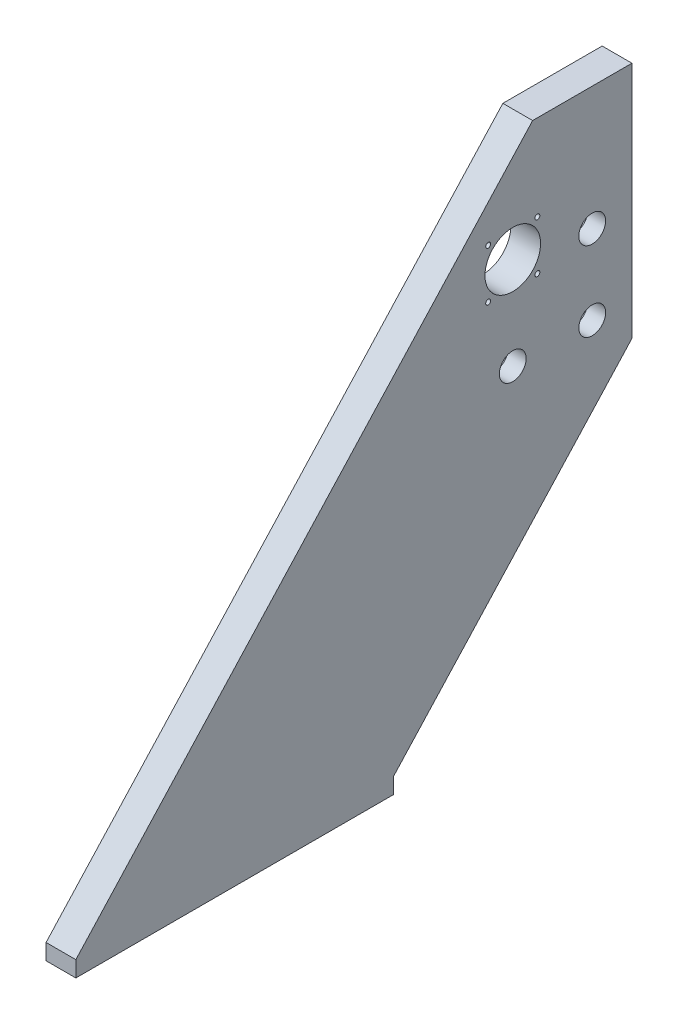
ISO-10303-21;
HEADER;
FILE_DESCRIPTION(('STEP AP214'),'2;1');
FILE_NAME('part.step','',(''),(''),'','','');
FILE_SCHEMA(('AUTOMOTIVE_DESIGN { 1 0 10303 214 1 1 1 1 }'));
ENDSEC;
DATA;
#1=APPLICATION_CONTEXT('core data for automotive mechanical design processes');
#2=APPLICATION_PROTOCOL_DEFINITION('international standard','automotive_design',2000,#1);
#3=PRODUCT_CONTEXT('',#1,'mechanical');
#4=PRODUCT('Part','Part','',(#3));
#5=PRODUCT_RELATED_PRODUCT_CATEGORY('part','',(#4));
#6=PRODUCT_DEFINITION_FORMATION('','',#4);
#7=PRODUCT_DEFINITION_CONTEXT('part definition',#1,'design');
#8=PRODUCT_DEFINITION('design','',#6,#7);
#9=PRODUCT_DEFINITION_SHAPE('','',#8);
#10=(LENGTH_UNIT() NAMED_UNIT(*) SI_UNIT(.MILLI.,.METRE.));
#11=(NAMED_UNIT(*) PLANE_ANGLE_UNIT() SI_UNIT($,.RADIAN.));
#12=(NAMED_UNIT(*) SI_UNIT($,.STERADIAN.) SOLID_ANGLE_UNIT());
#13=UNCERTAINTY_MEASURE_WITH_UNIT(LENGTH_MEASURE(1.E-05),#10,'distance_accuracy_value','');
#14=(GEOMETRIC_REPRESENTATION_CONTEXT(3) GLOBAL_UNCERTAINTY_ASSIGNED_CONTEXT((#13)) GLOBAL_UNIT_ASSIGNED_CONTEXT((#10,
#11,#12)) REPRESENTATION_CONTEXT('',''));
#15=CARTESIAN_POINT('',(0.,0.,0.));
#16=DIRECTION('',(0.,0.,1.));
#17=DIRECTION('',(1.,0.,0.));
#18=AXIS2_PLACEMENT_3D('',#15,#16,#17);
#19=CARTESIAN_POINT('',(7.5,8.,80.));
#20=DIRECTION('',(0.,0.,-1.));
#21=DIRECTION('',(0.,1.,0.));
#22=AXIS2_PLACEMENT_3D('',#19,#20,#21);
#23=PLANE('',#22);
#24=DIRECTION('',(0.,-1.,0.));
#25=VECTOR('',#24,1.);
#26=CARTESIAN_POINT('',(-7.5,8.,80.));
#27=LINE('',#26,#25);
#28=CARTESIAN_POINT('',(-7.5,8.,80.));
#29=VERTEX_POINT('',#28);
#30=CARTESIAN_POINT('',(-7.5,0.,80.));
#31=VERTEX_POINT('',#30);
#32=EDGE_CURVE('E145',#29,#31,#27,.T.);
#33=ORIENTED_EDGE('',*,*,#32,.T.);
#34=DIRECTION('',(-1.,0.,0.));
#35=VECTOR('',#34,1.);
#36=CARTESIAN_POINT('',(7.5,0.,80.));
#37=LINE('',#36,#35);
#38=CARTESIAN_POINT('',(7.5,0.,80.));
#39=VERTEX_POINT('',#38);
#40=EDGE_CURVE('E11',#39,#31,#37,.T.);
#41=ORIENTED_EDGE('',*,*,#40,.F.);
#42=DIRECTION('',(0.,-1.,0.));
#43=VECTOR('',#42,1.);
#44=CARTESIAN_POINT('',(7.5,8.,80.));
#45=LINE('',#44,#43);
#46=CARTESIAN_POINT('',(7.5,8.,80.));
#47=VERTEX_POINT('',#46);
#48=EDGE_CURVE('E165',#47,#39,#45,.T.);
#49=ORIENTED_EDGE('',*,*,#48,.F.);
#50=DIRECTION('',(-1.,0.,0.));
#51=VECTOR('',#50,1.);
#52=CARTESIAN_POINT('',(7.5,8.,80.));
#53=LINE('',#52,#51);
#54=EDGE_CURVE('E141',#47,#29,#53,.T.);
#55=ORIENTED_EDGE('',*,*,#54,.T.);
#56=EDGE_LOOP('',(#33,#41,#49,#55));
#57=FACE_BOUND('',#56,.T.);
#58=ADVANCED_FACE('F45',(#57),#23,.F.);
#59=CARTESIAN_POINT('',(7.5,0.,0.));
#60=DIRECTION('',(0.,1.,0.));
#61=DIRECTION('',(0.,0.,1.));
#62=AXIS2_PLACEMENT_3D('',#59,#60,#61);
#63=PLANE('',#62);
#64=CARTESIAN_POINT('',(0.,0.,50.));
#65=DIRECTION('',(0.,-1.,0.));
#66=DIRECTION('',(0.,0.,-1.));
#67=AXIS2_PLACEMENT_3D('',#64,#65,#66);
#68=CIRCLE('',#67,3.4);
#69=CARTESIAN_POINT('',(0.,0.,46.6));
#70=VERTEX_POINT('',#69);
#71=EDGE_CURVE('E210',#70,#70,#68,.T.);
#72=ORIENTED_EDGE('',*,*,#71,.F.);
#73=EDGE_LOOP('',(#72));
#74=FACE_BOUND('',#73,.T.);
#75=CARTESIAN_POINT('',(0.,0.,-50.));
#76=DIRECTION('',(0.,-1.,0.));
#77=DIRECTION('',(0.,0.,-1.));
#78=AXIS2_PLACEMENT_3D('',#75,#76,#77);
#79=CIRCLE('',#78,3.4);
#80=CARTESIAN_POINT('',(0.,0.,-53.4));
#81=VERTEX_POINT('',#80);
#82=EDGE_CURVE('E202',#81,#81,#79,.T.);
#83=ORIENTED_EDGE('',*,*,#82,.F.);
#84=EDGE_LOOP('',(#83));
#85=FACE_BOUND('',#84,.T.);
#86=DIRECTION('',(0.,0.,-1.));
#87=VECTOR('',#86,1.);
#88=CARTESIAN_POINT('',(-7.5,0.,0.));
#89=LINE('',#88,#87);
#90=CARTESIAN_POINT('',(-7.5,0.,-80.));
#91=VERTEX_POINT('',#90);
#92=EDGE_CURVE('E149',#31,#91,#89,.T.);
#93=ORIENTED_EDGE('',*,*,#92,.T.);
#94=DIRECTION('',(-1.,0.,0.));
#95=VECTOR('',#94,1.);
#96=CARTESIAN_POINT('',(7.5,0.,-80.));
#97=LINE('',#96,#95);
#98=CARTESIAN_POINT('',(7.5,0.,-80.));
#99=VERTEX_POINT('',#98);
#100=EDGE_CURVE('E54',#99,#91,#97,.T.);
#101=ORIENTED_EDGE('',*,*,#100,.F.);
#102=DIRECTION('',(0.,0.,-1.));
#103=VECTOR('',#102,1.);
#104=CARTESIAN_POINT('',(7.5,0.,80.));
#105=LINE('',#104,#103);
#106=EDGE_CURVE('E103',#39,#99,#105,.T.);
#107=ORIENTED_EDGE('',*,*,#106,.F.);
#108=ORIENTED_EDGE('',*,*,#40,.T.);
#109=EDGE_LOOP('',(#93,#101,#107,#108));
#110=FACE_BOUND('',#109,.T.);
#111=ADVANCED_FACE('F365',(#74,#85,#110),#63,.F.);
#112=CARTESIAN_POINT('',(7.5,0.,-80.));
#113=DIRECTION('',(0.,0.,1.));
#114=DIRECTION('',(1.,0.,0.));
#115=AXIS2_PLACEMENT_3D('',#112,#113,#114);
#116=PLANE('',#115);
#117=DIRECTION('',(0.,1.,0.));
#118=VECTOR('',#117,1.);
#119=CARTESIAN_POINT('',(-7.5,0.,-80.));
#120=LINE('',#119,#118);
#121=CARTESIAN_POINT('',(-7.5,8.,-80.));
#122=VERTEX_POINT('',#121);
#123=EDGE_CURVE('E153',#91,#122,#120,.T.);
#124=ORIENTED_EDGE('',*,*,#123,.T.);
#125=DIRECTION('',(-1.,0.,0.));
#126=VECTOR('',#125,1.);
#127=CARTESIAN_POINT('',(7.5,8.,-80.));
#128=LINE('',#127,#126);
#129=CARTESIAN_POINT('',(7.5,8.,-80.));
#130=VERTEX_POINT('',#129);
#131=EDGE_CURVE('E172',#130,#122,#128,.T.);
#132=ORIENTED_EDGE('',*,*,#131,.F.);
#133=DIRECTION('',(0.,1.,0.));
#134=VECTOR('',#133,1.);
#135=CARTESIAN_POINT('',(7.5,0.,-80.));
#136=LINE('',#135,#134);
#137=EDGE_CURVE('E184',#99,#130,#136,.T.);
#138=ORIENTED_EDGE('',*,*,#137,.F.);
#139=ORIENTED_EDGE('',*,*,#100,.T.);
#140=EDGE_LOOP('',(#124,#132,#138,#139));
#141=FACE_BOUND('',#140,.T.);
#142=ADVANCED_FACE('F182',(#141),#116,.F.);
#143=CARTESIAN_POINT('',(7.5,8.,-80.));
#144=DIRECTION('',(0.,0.675724628517346,0.737154140200741));
#145=DIRECTION('',(0.,-0.737154140200741,0.675724628517346));
#146=AXIS2_PLACEMENT_3D('',#143,#144,#145);
#147=PLANE('',#146);
#148=DIRECTION('',(0.,0.737154140200741,-0.675724628517346));
#149=VECTOR('',#148,1.);
#150=CARTESIAN_POINT('',(-7.5,8.,-80.));
#151=LINE('',#150,#149);
#152=CARTESIAN_POINT('',(-7.5,138.909090909091,-200.));
#153=VERTEX_POINT('',#152);
#154=EDGE_CURVE('E156',#122,#153,#151,.T.);
#155=ORIENTED_EDGE('',*,*,#154,.T.);
#156=DIRECTION('',(-1.,0.,0.));
#157=VECTOR('',#156,1.);
#158=CARTESIAN_POINT('',(7.5,138.909090909091,-200.));
#159=LINE('',#158,#157);
#160=CARTESIAN_POINT('',(7.5,138.909090909091,-200.));
#161=VERTEX_POINT('',#160);
#162=EDGE_CURVE('E132',#161,#153,#159,.T.);
#163=ORIENTED_EDGE('',*,*,#162,.F.);
#164=DIRECTION('',(0.,0.737154140200741,-0.675724628517346));
#165=VECTOR('',#164,1.);
#166=CARTESIAN_POINT('',(7.5,8.,-80.));
#167=LINE('',#166,#165);
#168=EDGE_CURVE('E121',#130,#161,#167,.T.);
#169=ORIENTED_EDGE('',*,*,#168,.F.);
#170=ORIENTED_EDGE('',*,*,#131,.T.);
#171=EDGE_LOOP('',(#155,#163,#169,#170));
#172=FACE_BOUND('',#171,.T.);
#173=ADVANCED_FACE('F190',(#172),#147,.F.);
#174=CARTESIAN_POINT('',(7.5,138.909090909091,-200.));
#175=DIRECTION('',(0.,0.,1.));
#176=DIRECTION('',(1.,0.,0.));
#177=AXIS2_PLACEMENT_3D('',#174,#175,#176);
#178=PLANE('',#177);
#179=DIRECTION('',(0.,1.,0.));
#180=VECTOR('',#179,1.);
#181=CARTESIAN_POINT('',(-7.5,138.909090909091,-200.));
#182=LINE('',#181,#180);
#183=CARTESIAN_POINT('',(-7.5,258.909090909091,-200.));
#184=VERTEX_POINT('',#183);
#185=EDGE_CURVE('E130',#153,#184,#182,.T.);
#186=ORIENTED_EDGE('',*,*,#185,.T.);
#187=DIRECTION('',(-1.,0.,0.));
#188=VECTOR('',#187,1.);
#189=CARTESIAN_POINT('',(7.5,258.909090909091,-200.));
#190=LINE('',#189,#188);
#191=CARTESIAN_POINT('',(7.5,258.909090909091,-200.));
#192=VERTEX_POINT('',#191);
#193=EDGE_CURVE('E127',#192,#184,#190,.T.);
#194=ORIENTED_EDGE('',*,*,#193,.F.);
#195=DIRECTION('',(0.,1.,0.));
#196=VECTOR('',#195,1.);
#197=CARTESIAN_POINT('',(7.5,138.909090909091,-200.));
#198=LINE('',#197,#196);
#199=EDGE_CURVE('E115',#161,#192,#198,.T.);
#200=ORIENTED_EDGE('',*,*,#199,.F.);
#201=ORIENTED_EDGE('',*,*,#162,.T.);
#202=EDGE_LOOP('',(#186,#194,#200,#201));
#203=FACE_BOUND('',#202,.T.);
#204=ADVANCED_FACE('F128',(#203),#178,.F.);
#205=CARTESIAN_POINT('',(7.5,258.909090909091,-200.));
#206=DIRECTION('',(0.,-1.,0.));
#207=DIRECTION('',(0.,0.,-1.));
#208=AXIS2_PLACEMENT_3D('',#205,#206,#207);
#209=PLANE('',#208);
#210=DIRECTION('',(0.,0.,1.));
#211=VECTOR('',#210,1.);
#212=CARTESIAN_POINT('',(-7.5,258.909090909091,-200.));
#213=LINE('',#212,#211);
#214=CARTESIAN_POINT('',(-7.5,258.909090909091,-150.));
#215=VERTEX_POINT('',#214);
#216=EDGE_CURVE('E89',#184,#215,#213,.T.);
#217=ORIENTED_EDGE('',*,*,#216,.T.);
#218=DIRECTION('',(-1.,0.,0.));
#219=VECTOR('',#218,1.);
#220=CARTESIAN_POINT('',(7.5,258.909090909091,-150.));
#221=LINE('',#220,#219);
#222=CARTESIAN_POINT('',(7.5,258.909090909091,-150.));
#223=VERTEX_POINT('',#222);
#224=EDGE_CURVE('E133',#223,#215,#221,.T.);
#225=ORIENTED_EDGE('',*,*,#224,.F.);
#226=DIRECTION('',(0.,0.,1.));
#227=VECTOR('',#226,1.);
#228=CARTESIAN_POINT('',(7.5,258.909090909091,-200.));
#229=LINE('',#228,#227);
#230=EDGE_CURVE('E119',#192,#223,#229,.T.);
#231=ORIENTED_EDGE('',*,*,#230,.F.);
#232=ORIENTED_EDGE('',*,*,#193,.T.);
#233=EDGE_LOOP('',(#217,#225,#231,#232));
#234=FACE_BOUND('',#233,.T.);
#235=ADVANCED_FACE('F135',(#234),#209,.F.);
#236=CARTESIAN_POINT('',(7.5,258.909090909091,-150.));
#237=DIRECTION('',(0.,-0.675724628517346,-0.737154140200741));
#238=DIRECTION('',(0.,0.737154140200742,-0.675724628517346));
#239=AXIS2_PLACEMENT_3D('',#236,#237,#238);
#240=PLANE('',#239);
#241=DIRECTION('',(0.,-0.737154140200742,0.675724628517346));
#242=VECTOR('',#241,1.);
#243=CARTESIAN_POINT('',(-7.5,258.909090909091,-150.));
#244=LINE('',#243,#242);
#245=EDGE_CURVE('E95',#215,#29,#244,.T.);
#246=ORIENTED_EDGE('',*,*,#245,.T.);
#247=ORIENTED_EDGE('',*,*,#54,.F.);
#248=DIRECTION('',(0.,-0.737154140200742,0.675724628517346));
#249=VECTOR('',#248,1.);
#250=CARTESIAN_POINT('',(7.5,258.909090909091,-150.));
#251=LINE('',#250,#249);
#252=EDGE_CURVE('E62',#223,#47,#251,.T.);
#253=ORIENTED_EDGE('',*,*,#252,.F.);
#254=ORIENTED_EDGE('',*,*,#224,.T.);
#255=EDGE_LOOP('',(#246,#247,#253,#254));
#256=FACE_BOUND('',#255,.T.);
#257=ADVANCED_FACE('F373',(#256),#240,.F.);
#258=CARTESIAN_POINT('',(7.5,0.,0.));
#259=DIRECTION('',(1.,0.,0.));
#260=DIRECTION('',(0.,0.,-1.));
#261=AXIS2_PLACEMENT_3D('',#258,#259,#260);
#262=PLANE('',#261);
#263=CARTESIAN_POINT('',(7.5,215.684368670765,-127.625631329235));
#264=DIRECTION('',(-1.,0.,0.));
#265=DIRECTION('',(0.,0.,1.));
#266=AXIS2_PLACEMENT_3D('',#263,#264,#265);
#267=CIRCLE('',#266,1.25);
#268=CARTESIAN_POINT('',(7.5,215.684368670765,-126.375631329235));
#269=VERTEX_POINT('',#268);
#270=EDGE_CURVE('E314',#269,#269,#267,.T.);
#271=ORIENTED_EDGE('',*,*,#270,.T.);
#272=EDGE_LOOP('',(#271));
#273=FACE_BOUND('',#272,.T.);
#274=CARTESIAN_POINT('',(7.5,190.935631329235,-127.625631329235));
#275=DIRECTION('',(-1.,0.,0.));
#276=DIRECTION('',(0.,0.,1.));
#277=AXIS2_PLACEMENT_3D('',#274,#275,#276);
#278=CIRCLE('',#277,1.25);
#279=CARTESIAN_POINT('',(7.5,190.935631329235,-126.375631329235));
#280=VERTEX_POINT('',#279);
#281=EDGE_CURVE('E303',#280,#280,#278,.T.);
#282=ORIENTED_EDGE('',*,*,#281,.T.);
#283=EDGE_LOOP('',(#282));
#284=FACE_BOUND('',#283,.T.);
#285=CARTESIAN_POINT('',(7.5,190.935631329235,-152.374368670765));
#286=DIRECTION('',(-1.,0.,0.));
#287=DIRECTION('',(0.,0.,1.));
#288=AXIS2_PLACEMENT_3D('',#285,#286,#287);
#289=CIRCLE('',#288,1.25);
#290=CARTESIAN_POINT('',(7.5,190.935631329235,-151.124368670765));
#291=VERTEX_POINT('',#290);
#292=EDGE_CURVE('E291',#291,#291,#289,.T.);
#293=ORIENTED_EDGE('',*,*,#292,.T.);
#294=EDGE_LOOP('',(#293));
#295=FACE_BOUND('',#294,.T.);
#296=CARTESIAN_POINT('',(7.5,215.684368670765,-152.374368670765));
#297=DIRECTION('',(-1.,0.,0.));
#298=DIRECTION('',(0.,0.,1.));
#299=AXIS2_PLACEMENT_3D('',#296,#297,#298);
#300=CIRCLE('',#299,1.25);
#301=CARTESIAN_POINT('',(7.5,215.684368670765,-151.124368670765));
#302=VERTEX_POINT('',#301);
#303=EDGE_CURVE('E277',#302,#302,#300,.T.);
#304=ORIENTED_EDGE('',*,*,#303,.T.);
#305=EDGE_LOOP('',(#304));
#306=FACE_BOUND('',#305,.T.);
#307=CARTESIAN_POINT('',(7.5,203.31,-140.));
#308=DIRECTION('',(-1.,0.,0.));
#309=DIRECTION('',(0.,0.,1.));
#310=AXIS2_PLACEMENT_3D('',#307,#308,#309);
#311=CIRCLE('',#310,14.);
#312=CARTESIAN_POINT('',(7.5,203.31,-126.));
#313=VERTEX_POINT('',#312);
#314=EDGE_CURVE('E272',#313,#313,#311,.T.);
#315=ORIENTED_EDGE('',*,*,#314,.T.);
#316=EDGE_LOOP('',(#315));
#317=FACE_BOUND('',#316,.T.);
#318=CARTESIAN_POINT('',(7.5,196.809090909091,-180.));
#319=DIRECTION('',(-1.,0.,0.));
#320=DIRECTION('',(0.,0.,1.));
#321=AXIS2_PLACEMENT_3D('',#318,#319,#320);
#322=CIRCLE('',#321,6.75000000000001);
#323=CARTESIAN_POINT('',(7.5,196.809090909091,-173.25));
#324=VERTEX_POINT('',#323);
#325=EDGE_CURVE('E253',#324,#324,#322,.T.);
#326=ORIENTED_EDGE('',*,*,#325,.T.);
#327=EDGE_LOOP('',(#326));
#328=FACE_BOUND('',#327,.T.);
#329=CARTESIAN_POINT('',(7.5,156.809090909091,-180.));
#330=DIRECTION('',(-1.,0.,0.));
#331=DIRECTION('',(0.,0.,1.));
#332=AXIS2_PLACEMENT_3D('',#329,#330,#331);
#333=CIRCLE('',#332,6.75000000000001);
#334=CARTESIAN_POINT('',(7.5,156.809090909091,-173.25));
#335=VERTEX_POINT('',#334);
#336=EDGE_CURVE('E233',#335,#335,#333,.T.);
#337=ORIENTED_EDGE('',*,*,#336,.T.);
#338=EDGE_LOOP('',(#337));
#339=FACE_BOUND('',#338,.T.);
#340=CARTESIAN_POINT('',(7.5,156.809090909091,-140.));
#341=DIRECTION('',(-1.,0.,0.));
#342=DIRECTION('',(0.,0.,1.));
#343=AXIS2_PLACEMENT_3D('',#340,#341,#342);
#344=CIRCLE('',#343,6.75000000000001);
#345=CARTESIAN_POINT('',(7.5,156.809090909091,-133.25));
#346=VERTEX_POINT('',#345);
#347=EDGE_CURVE('E214',#346,#346,#344,.T.);
#348=ORIENTED_EDGE('',*,*,#347,.T.);
#349=EDGE_LOOP('',(#348));
#350=FACE_BOUND('',#349,.T.);
#351=ORIENTED_EDGE('',*,*,#48,.T.);
#352=ORIENTED_EDGE('',*,*,#106,.T.);
#353=ORIENTED_EDGE('',*,*,#137,.T.);
#354=ORIENTED_EDGE('',*,*,#168,.T.);
#355=ORIENTED_EDGE('',*,*,#199,.T.);
#356=ORIENTED_EDGE('',*,*,#230,.T.);
#357=ORIENTED_EDGE('',*,*,#252,.T.);
#358=EDGE_LOOP('',(#351,#352,#353,#354,#355,#356,#357));
#359=FACE_BOUND('',#358,.T.);
#360=ADVANCED_FACE('F117',(#273,#284,#295,#306,#317,#328,#339,#350,#359),#262,.T.);
#361=CARTESIAN_POINT('',(-7.5,0.,0.));
#362=DIRECTION('',(1.,0.,0.));
#363=DIRECTION('',(0.,0.,-1.));
#364=AXIS2_PLACEMENT_3D('',#361,#362,#363);
#365=PLANE('',#364);
#366=CARTESIAN_POINT('',(-7.5,215.684368670765,-127.625631329235));
#367=DIRECTION('',(-1.,0.,0.));
#368=DIRECTION('',(0.,0.,1.));
#369=AXIS2_PLACEMENT_3D('',#366,#367,#368);
#370=CIRCLE('',#369,1.525);
#371=CARTESIAN_POINT('',(-7.5,215.684368670765,-126.100631329235));
#372=VERTEX_POINT('',#371);
#373=EDGE_CURVE('E322',#372,#372,#370,.T.);
#374=ORIENTED_EDGE('',*,*,#373,.F.);
#375=EDGE_LOOP('',(#374));
#376=FACE_BOUND('',#375,.T.);
#377=CARTESIAN_POINT('',(-7.5,190.935631329235,-127.625631329235));
#378=DIRECTION('',(-1.,0.,0.));
#379=DIRECTION('',(0.,0.,1.));
#380=AXIS2_PLACEMENT_3D('',#377,#378,#379);
#381=CIRCLE('',#380,1.525);
#382=CARTESIAN_POINT('',(-7.5,190.935631329235,-126.100631329235));
#383=VERTEX_POINT('',#382);
#384=EDGE_CURVE('E311',#383,#383,#381,.T.);
#385=ORIENTED_EDGE('',*,*,#384,.F.);
#386=EDGE_LOOP('',(#385));
#387=FACE_BOUND('',#386,.T.);
#388=CARTESIAN_POINT('',(-7.5,190.935631329235,-152.374368670765));
#389=DIRECTION('',(-1.,0.,0.));
#390=DIRECTION('',(0.,0.,1.));
#391=AXIS2_PLACEMENT_3D('',#388,#389,#390);
#392=CIRCLE('',#391,1.525);
#393=CARTESIAN_POINT('',(-7.5,190.935631329235,-150.849368670765));
#394=VERTEX_POINT('',#393);
#395=EDGE_CURVE('E299',#394,#394,#392,.T.);
#396=ORIENTED_EDGE('',*,*,#395,.F.);
#397=EDGE_LOOP('',(#396));
#398=FACE_BOUND('',#397,.T.);
#399=CARTESIAN_POINT('',(-7.5,215.684368670765,-152.374368670765));
#400=DIRECTION('',(-1.,0.,0.));
#401=DIRECTION('',(0.,0.,1.));
#402=AXIS2_PLACEMENT_3D('',#399,#400,#401);
#403=CIRCLE('',#402,1.525);
#404=CARTESIAN_POINT('',(-7.5,215.684368670765,-150.849368670765));
#405=VERTEX_POINT('',#404);
#406=EDGE_CURVE('E287',#405,#405,#403,.T.);
#407=ORIENTED_EDGE('',*,*,#406,.F.);
#408=EDGE_LOOP('',(#407));
#409=FACE_BOUND('',#408,.T.);
#410=CARTESIAN_POINT('',(-7.5,203.31,-140.));
#411=DIRECTION('',(-1.,0.,0.));
#412=DIRECTION('',(0.,0.,1.));
#413=AXIS2_PLACEMENT_3D('',#410,#411,#412);
#414=CIRCLE('',#413,14.);
#415=CARTESIAN_POINT('',(-7.5,203.31,-126.));
#416=VERTEX_POINT('',#415);
#417=EDGE_CURVE('E273',#416,#416,#414,.T.);
#418=ORIENTED_EDGE('',*,*,#417,.F.);
#419=EDGE_LOOP('',(#418));
#420=FACE_BOUND('',#419,.T.);
#421=CARTESIAN_POINT('',(-7.5,196.809090909091,-180.));
#422=DIRECTION('',(-1.,0.,0.));
#423=DIRECTION('',(0.,0.,1.));
#424=AXIS2_PLACEMENT_3D('',#421,#422,#423);
#425=CIRCLE('',#424,10.025);
#426=CARTESIAN_POINT('',(-7.5,196.809090909091,-169.975));
#427=VERTEX_POINT('',#426);
#428=EDGE_CURVE('E268',#427,#427,#425,.T.);
#429=ORIENTED_EDGE('',*,*,#428,.F.);
#430=EDGE_LOOP('',(#429));
#431=FACE_BOUND('',#430,.T.);
#432=CARTESIAN_POINT('',(-7.5,156.809090909091,-180.));
#433=DIRECTION('',(-1.,0.,0.));
#434=DIRECTION('',(0.,0.,1.));
#435=AXIS2_PLACEMENT_3D('',#432,#433,#434);
#436=CIRCLE('',#435,10.025);
#437=CARTESIAN_POINT('',(-7.5,156.809090909091,-169.975));
#438=VERTEX_POINT('',#437);
#439=EDGE_CURVE('E249',#438,#438,#436,.T.);
#440=ORIENTED_EDGE('',*,*,#439,.F.);
#441=EDGE_LOOP('',(#440));
#442=FACE_BOUND('',#441,.T.);
#443=CARTESIAN_POINT('',(-7.5,156.809090909091,-140.));
#444=DIRECTION('',(-1.,0.,0.));
#445=DIRECTION('',(0.,0.,1.));
#446=AXIS2_PLACEMENT_3D('',#443,#444,#445);
#447=CIRCLE('',#446,10.025);
#448=CARTESIAN_POINT('',(-7.5,156.809090909091,-129.975));
#449=VERTEX_POINT('',#448);
#450=EDGE_CURVE('E229',#449,#449,#447,.T.);
#451=ORIENTED_EDGE('',*,*,#450,.F.);
#452=EDGE_LOOP('',(#451));
#453=FACE_BOUND('',#452,.T.);
#454=ORIENTED_EDGE('',*,*,#32,.F.);
#455=ORIENTED_EDGE('',*,*,#245,.F.);
#456=ORIENTED_EDGE('',*,*,#216,.F.);
#457=ORIENTED_EDGE('',*,*,#185,.F.);
#458=ORIENTED_EDGE('',*,*,#154,.F.);
#459=ORIENTED_EDGE('',*,*,#123,.F.);
#460=ORIENTED_EDGE('',*,*,#92,.F.);
#461=EDGE_LOOP('',(#454,#455,#456,#457,#458,#459,#460));
#462=FACE_BOUND('',#461,.T.);
#463=ADVANCED_FACE('F188',(#376,#387,#398,#409,#420,#431,#442,#453,#462),#365,.F.);
#464=CARTESIAN_POINT('',(0.,30.,-50.));
#465=DIRECTION('',(0.,-1.,0.));
#466=DIRECTION('',(0.,0.,-1.));
#467=AXIS2_PLACEMENT_3D('',#464,#465,#466);
#468=CONICAL_SURFACE('',#467,3.39999999999999,1.02974425867665);
#469=CARTESIAN_POINT('',(0.,32.0429261046937,-50.));
#470=VERTEX_POINT('',#469);
#471=VERTEX_LOOP('',#470);
#472=FACE_BOUND('',#471,.T.);
#473=CARTESIAN_POINT('',(0.,30.,-50.));
#474=DIRECTION('',(0.,-1.,0.));
#475=DIRECTION('',(0.,0.,-1.));
#476=AXIS2_PLACEMENT_3D('',#473,#474,#475);
#477=CIRCLE('',#476,3.39999999999999);
#478=CARTESIAN_POINT('',(0.,30.,-53.4));
#479=VERTEX_POINT('',#478);
#480=EDGE_CURVE('E150',#479,#479,#477,.T.);
#481=ORIENTED_EDGE('',*,*,#480,.T.);
#482=EDGE_LOOP('',(#481));
#483=FACE_BOUND('',#482,.T.);
#484=ADVANCED_FACE('F331',(#472,#483),#468,.F.);
#485=CARTESIAN_POINT('',(0.,0.,-50.));
#486=DIRECTION('',(0.,-1.,0.));
#487=DIRECTION('',(0.,0.,-1.));
#488=AXIS2_PLACEMENT_3D('',#485,#486,#487);
#489=CYLINDRICAL_SURFACE('',#488,3.4);
#490=ORIENTED_EDGE('',*,*,#480,.F.);
#491=EDGE_LOOP('',(#490));
#492=FACE_BOUND('',#491,.T.);
#493=ORIENTED_EDGE('',*,*,#82,.T.);
#494=EDGE_LOOP('',(#493));
#495=FACE_BOUND('',#494,.T.);
#496=ADVANCED_FACE('F425',(#492,#495),#489,.F.);
#497=CARTESIAN_POINT('',(0.,30.,50.));
#498=DIRECTION('',(0.,-1.,0.));
#499=DIRECTION('',(0.,0.,-1.));
#500=AXIS2_PLACEMENT_3D('',#497,#498,#499);
#501=CONICAL_SURFACE('',#500,3.39999999999999,1.02974425867665);
#502=CARTESIAN_POINT('',(0.,32.0429261046937,50.));
#503=VERTEX_POINT('',#502);
#504=VERTEX_LOOP('',#503);
#505=FACE_BOUND('',#504,.T.);
#506=CARTESIAN_POINT('',(0.,30.,50.));
#507=DIRECTION('',(0.,-1.,0.));
#508=DIRECTION('',(0.,0.,-1.));
#509=AXIS2_PLACEMENT_3D('',#506,#507,#508);
#510=CIRCLE('',#509,3.39999999999999);
#511=CARTESIAN_POINT('',(0.,30.,46.6));
#512=VERTEX_POINT('',#511);
#513=EDGE_CURVE('E206',#512,#512,#510,.T.);
#514=ORIENTED_EDGE('',*,*,#513,.T.);
#515=EDGE_LOOP('',(#514));
#516=FACE_BOUND('',#515,.T.);
#517=ADVANCED_FACE('F435',(#505,#516),#501,.F.);
#518=CARTESIAN_POINT('',(0.,0.,50.));
#519=DIRECTION('',(0.,-1.,0.));
#520=DIRECTION('',(0.,0.,-1.));
#521=AXIS2_PLACEMENT_3D('',#518,#519,#520);
#522=CYLINDRICAL_SURFACE('',#521,3.4);
#523=ORIENTED_EDGE('',*,*,#513,.F.);
#524=EDGE_LOOP('',(#523));
#525=FACE_BOUND('',#524,.T.);
#526=ORIENTED_EDGE('',*,*,#71,.T.);
#527=EDGE_LOOP('',(#526));
#528=FACE_BOUND('',#527,.T.);
#529=ADVANCED_FACE('F445',(#525,#528),#522,.F.);
#530=CARTESIAN_POINT('',(-7.5,156.809090909091,-140.));
#531=DIRECTION('',(-1.,0.,0.));
#532=DIRECTION('',(0.,0.,1.));
#533=AXIS2_PLACEMENT_3D('',#530,#531,#532);
#534=CYLINDRICAL_SURFACE('',#533,6.75000000000001);
#535=ORIENTED_EDGE('',*,*,#347,.F.);
#536=EDGE_LOOP('',(#535));
#537=FACE_BOUND('',#536,.T.);
#538=CARTESIAN_POINT('',(-1.5,156.809090909091,-140.));
#539=DIRECTION('',(-1.,0.,0.));
#540=DIRECTION('',(0.,0.,1.));
#541=AXIS2_PLACEMENT_3D('',#538,#539,#540);
#542=CIRCLE('',#541,6.75000000000001);
#543=CARTESIAN_POINT('',(-1.5,156.809090909091,-133.25));
#544=VERTEX_POINT('',#543);
#545=EDGE_CURVE('E218',#544,#544,#542,.T.);
#546=ORIENTED_EDGE('',*,*,#545,.T.);
#547=EDGE_LOOP('',(#546));
#548=FACE_BOUND('',#547,.T.);
#549=ADVANCED_FACE('F454',(#537,#548),#534,.F.);
#550=CARTESIAN_POINT('',(-1.5,166.809090909091,-140.));
#551=DIRECTION('',(1.,0.,0.));
#552=DIRECTION('',(0.,0.,-1.));
#553=AXIS2_PLACEMENT_3D('',#550,#551,#552);
#554=PLANE('',#553);
#555=ORIENTED_EDGE('',*,*,#545,.F.);
#556=EDGE_LOOP('',(#555));
#557=FACE_BOUND('',#556,.T.);
#558=CARTESIAN_POINT('',(-1.5,156.809090909091,-140.));
#559=DIRECTION('',(-1.,0.,0.));
#560=DIRECTION('',(0.,0.,1.));
#561=AXIS2_PLACEMENT_3D('',#558,#559,#560);
#562=CIRCLE('',#561,10.);
#563=CARTESIAN_POINT('',(-1.5,156.809090909091,-130.));
#564=VERTEX_POINT('',#563);
#565=EDGE_CURVE('E221',#564,#564,#562,.T.);
#566=ORIENTED_EDGE('',*,*,#565,.T.);
#567=EDGE_LOOP('',(#566));
#568=FACE_BOUND('',#567,.T.);
#569=ADVANCED_FACE('F360',(#557,#568),#554,.F.);
#570=CARTESIAN_POINT('',(-7.5,156.809090909091,-140.));
#571=DIRECTION('',(-1.,0.,0.));
#572=DIRECTION('',(0.,0.,1.));
#573=AXIS2_PLACEMENT_3D('',#570,#571,#572);
#574=CYLINDRICAL_SURFACE('',#573,10.);
#575=ORIENTED_EDGE('',*,*,#565,.F.);
#576=EDGE_LOOP('',(#575));
#577=FACE_BOUND('',#576,.T.);
#578=CARTESIAN_POINT('',(-7.475,156.809090909091,-140.));
#579=DIRECTION('',(-1.,0.,0.));
#580=DIRECTION('',(0.,0.,1.));
#581=AXIS2_PLACEMENT_3D('',#578,#579,#580);
#582=CIRCLE('',#581,10.);
#583=CARTESIAN_POINT('',(-7.475,156.809090909091,-130.));
#584=VERTEX_POINT('',#583);
#585=EDGE_CURVE('E225',#584,#584,#582,.T.);
#586=ORIENTED_EDGE('',*,*,#585,.T.);
#587=EDGE_LOOP('',(#586));
#588=FACE_BOUND('',#587,.T.);
#589=ADVANCED_FACE('F350',(#577,#588),#574,.F.);
#590=CARTESIAN_POINT('',(-7.5,156.809090909091,-140.));
#591=DIRECTION('',(-1.,0.,0.));
#592=DIRECTION('',(0.,0.,1.));
#593=AXIS2_PLACEMENT_3D('',#590,#591,#592);
#594=CONICAL_SURFACE('',#593,10.025,0.785398163397309);
#595=ORIENTED_EDGE('',*,*,#585,.F.);
#596=EDGE_LOOP('',(#595));
#597=FACE_BOUND('',#596,.T.);
#598=ORIENTED_EDGE('',*,*,#450,.T.);
#599=EDGE_LOOP('',(#598));
#600=FACE_BOUND('',#599,.T.);
#601=ADVANCED_FACE('F347',(#597,#600),#594,.F.);
#602=CARTESIAN_POINT('',(-7.5,156.809090909091,-180.));
#603=DIRECTION('',(-1.,0.,0.));
#604=DIRECTION('',(0.,0.,1.));
#605=AXIS2_PLACEMENT_3D('',#602,#603,#604);
#606=CYLINDRICAL_SURFACE('',#605,6.75000000000001);
#607=ORIENTED_EDGE('',*,*,#336,.F.);
#608=EDGE_LOOP('',(#607));
#609=FACE_BOUND('',#608,.T.);
#610=CARTESIAN_POINT('',(-1.5,156.809090909091,-180.));
#611=DIRECTION('',(-1.,0.,0.));
#612=DIRECTION('',(0.,0.,1.));
#613=AXIS2_PLACEMENT_3D('',#610,#611,#612);
#614=CIRCLE('',#613,6.75000000000001);
#615=CARTESIAN_POINT('',(-1.5,156.809090909091,-173.25));
#616=VERTEX_POINT('',#615);
#617=EDGE_CURVE('E237',#616,#616,#614,.T.);
#618=ORIENTED_EDGE('',*,*,#617,.T.);
#619=EDGE_LOOP('',(#618));
#620=FACE_BOUND('',#619,.T.);
#621=ADVANCED_FACE('F349',(#609,#620),#606,.F.);
#622=CARTESIAN_POINT('',(-1.5,166.809090909091,-180.));
#623=DIRECTION('',(1.,0.,0.));
#624=DIRECTION('',(0.,0.,-1.));
#625=AXIS2_PLACEMENT_3D('',#622,#623,#624);
#626=PLANE('',#625);
#627=ORIENTED_EDGE('',*,*,#617,.F.);
#628=EDGE_LOOP('',(#627));
#629=FACE_BOUND('',#628,.T.);
#630=CARTESIAN_POINT('',(-1.5,156.809090909091,-180.));
#631=DIRECTION('',(-1.,0.,0.));
#632=DIRECTION('',(0.,0.,1.));
#633=AXIS2_PLACEMENT_3D('',#630,#631,#632);
#634=CIRCLE('',#633,10.);
#635=CARTESIAN_POINT('',(-1.5,156.809090909091,-170.));
#636=VERTEX_POINT('',#635);
#637=EDGE_CURVE('E241',#636,#636,#634,.T.);
#638=ORIENTED_EDGE('',*,*,#637,.T.);
#639=EDGE_LOOP('',(#638));
#640=FACE_BOUND('',#639,.T.);
#641=ADVANCED_FACE('F357',(#629,#640),#626,.F.);
#642=CARTESIAN_POINT('',(-7.5,156.809090909091,-180.));
#643=DIRECTION('',(-1.,0.,0.));
#644=DIRECTION('',(0.,0.,1.));
#645=AXIS2_PLACEMENT_3D('',#642,#643,#644);
#646=CYLINDRICAL_SURFACE('',#645,10.);
#647=ORIENTED_EDGE('',*,*,#637,.F.);
#648=EDGE_LOOP('',(#647));
#649=FACE_BOUND('',#648,.T.);
#650=CARTESIAN_POINT('',(-7.475,156.809090909091,-180.));
#651=DIRECTION('',(-1.,0.,0.));
#652=DIRECTION('',(0.,0.,1.));
#653=AXIS2_PLACEMENT_3D('',#650,#651,#652);
#654=CIRCLE('',#653,10.);
#655=CARTESIAN_POINT('',(-7.475,156.809090909091,-170.));
#656=VERTEX_POINT('',#655);
#657=EDGE_CURVE('E245',#656,#656,#654,.T.);
#658=ORIENTED_EDGE('',*,*,#657,.T.);
#659=EDGE_LOOP('',(#658));
#660=FACE_BOUND('',#659,.T.);
#661=ADVANCED_FACE('F492',(#649,#660),#646,.F.);
#662=CARTESIAN_POINT('',(-7.5,156.809090909091,-180.));
#663=DIRECTION('',(-1.,0.,0.));
#664=DIRECTION('',(0.,0.,1.));
#665=AXIS2_PLACEMENT_3D('',#662,#663,#664);
#666=CONICAL_SURFACE('',#665,10.025,0.785398163397309);
#667=ORIENTED_EDGE('',*,*,#657,.F.);
#668=EDGE_LOOP('',(#667));
#669=FACE_BOUND('',#668,.T.);
#670=ORIENTED_EDGE('',*,*,#439,.T.);
#671=EDGE_LOOP('',(#670));
#672=FACE_BOUND('',#671,.T.);
#673=ADVANCED_FACE('F501',(#669,#672),#666,.F.);
#674=CARTESIAN_POINT('',(-7.5,196.809090909091,-180.));
#675=DIRECTION('',(-1.,0.,0.));
#676=DIRECTION('',(0.,0.,1.));
#677=AXIS2_PLACEMENT_3D('',#674,#675,#676);
#678=CYLINDRICAL_SURFACE('',#677,6.75000000000001);
#679=ORIENTED_EDGE('',*,*,#325,.F.);
#680=EDGE_LOOP('',(#679));
#681=FACE_BOUND('',#680,.T.);
#682=CARTESIAN_POINT('',(-1.5,196.809090909091,-180.));
#683=DIRECTION('',(-1.,0.,0.));
#684=DIRECTION('',(0.,0.,1.));
#685=AXIS2_PLACEMENT_3D('',#682,#683,#684);
#686=CIRCLE('',#685,6.75000000000001);
#687=CARTESIAN_POINT('',(-1.5,196.809090909091,-173.25));
#688=VERTEX_POINT('',#687);
#689=EDGE_CURVE('E257',#688,#688,#686,.T.);
#690=ORIENTED_EDGE('',*,*,#689,.T.);
#691=EDGE_LOOP('',(#690));
#692=FACE_BOUND('',#691,.T.);
#693=ADVANCED_FACE('F510',(#681,#692),#678,.F.);
#694=CARTESIAN_POINT('',(-1.5,206.809090909091,-180.));
#695=DIRECTION('',(1.,0.,0.));
#696=DIRECTION('',(0.,0.,-1.));
#697=AXIS2_PLACEMENT_3D('',#694,#695,#696);
#698=PLANE('',#697);
#699=ORIENTED_EDGE('',*,*,#689,.F.);
#700=EDGE_LOOP('',(#699));
#701=FACE_BOUND('',#700,.T.);
#702=CARTESIAN_POINT('',(-1.5,196.809090909091,-180.));
#703=DIRECTION('',(-1.,0.,0.));
#704=DIRECTION('',(0.,0.,1.));
#705=AXIS2_PLACEMENT_3D('',#702,#703,#704);
#706=CIRCLE('',#705,10.);
#707=CARTESIAN_POINT('',(-1.5,196.809090909091,-170.));
#708=VERTEX_POINT('',#707);
#709=EDGE_CURVE('E261',#708,#708,#706,.T.);
#710=ORIENTED_EDGE('',*,*,#709,.T.);
#711=EDGE_LOOP('',(#710));
#712=FACE_BOUND('',#711,.T.);
#713=ADVANCED_FACE('F519',(#701,#712),#698,.F.);
#714=CARTESIAN_POINT('',(-7.5,196.809090909091,-180.));
#715=DIRECTION('',(-1.,0.,0.));
#716=DIRECTION('',(0.,0.,1.));
#717=AXIS2_PLACEMENT_3D('',#714,#715,#716);
#718=CYLINDRICAL_SURFACE('',#717,10.);
#719=ORIENTED_EDGE('',*,*,#709,.F.);
#720=EDGE_LOOP('',(#719));
#721=FACE_BOUND('',#720,.T.);
#722=CARTESIAN_POINT('',(-7.475,196.809090909091,-180.));
#723=DIRECTION('',(-1.,0.,0.));
#724=DIRECTION('',(0.,0.,1.));
#725=AXIS2_PLACEMENT_3D('',#722,#723,#724);
#726=CIRCLE('',#725,10.);
#727=CARTESIAN_POINT('',(-7.475,196.809090909091,-170.));
#728=VERTEX_POINT('',#727);
#729=EDGE_CURVE('E264',#728,#728,#726,.T.);
#730=ORIENTED_EDGE('',*,*,#729,.T.);
#731=EDGE_LOOP('',(#730));
#732=FACE_BOUND('',#731,.T.);
#733=ADVANCED_FACE('F528',(#721,#732),#718,.F.);
#734=CARTESIAN_POINT('',(-7.5,196.809090909091,-180.));
#735=DIRECTION('',(-1.,0.,0.));
#736=DIRECTION('',(0.,0.,1.));
#737=AXIS2_PLACEMENT_3D('',#734,#735,#736);
#738=CONICAL_SURFACE('',#737,10.025,0.785398163397309);
#739=ORIENTED_EDGE('',*,*,#729,.F.);
#740=EDGE_LOOP('',(#739));
#741=FACE_BOUND('',#740,.T.);
#742=ORIENTED_EDGE('',*,*,#428,.T.);
#743=EDGE_LOOP('',(#742));
#744=FACE_BOUND('',#743,.T.);
#745=ADVANCED_FACE('F537',(#741,#744),#738,.F.);
#746=CARTESIAN_POINT('',(7.5,203.31,-140.));
#747=DIRECTION('',(-1.,0.,0.));
#748=DIRECTION('',(0.,0.,1.));
#749=AXIS2_PLACEMENT_3D('',#746,#747,#748);
#750=CYLINDRICAL_SURFACE('',#749,14.);
#751=ORIENTED_EDGE('',*,*,#314,.F.);
#752=EDGE_LOOP('',(#751));
#753=FACE_BOUND('',#752,.T.);
#754=ORIENTED_EDGE('',*,*,#417,.T.);
#755=EDGE_LOOP('',(#754));
#756=FACE_BOUND('',#755,.T.);
#757=ADVANCED_FACE('F546',(#753,#756),#750,.F.);
#758=CARTESIAN_POINT('',(-7.5,215.684368670765,-152.374368670765));
#759=DIRECTION('',(-1.,0.,0.));
#760=DIRECTION('',(0.,0.,1.));
#761=AXIS2_PLACEMENT_3D('',#758,#759,#760);
#762=CYLINDRICAL_SURFACE('',#761,1.25);
#763=ORIENTED_EDGE('',*,*,#303,.F.);
#764=EDGE_LOOP('',(#763));
#765=FACE_BOUND('',#764,.T.);
#766=CARTESIAN_POINT('',(-7.225,215.684368670765,-152.374368670765));
#767=DIRECTION('',(-1.,0.,0.));
#768=DIRECTION('',(0.,0.,1.));
#769=AXIS2_PLACEMENT_3D('',#766,#767,#768);
#770=CIRCLE('',#769,1.25);
#771=CARTESIAN_POINT('',(-7.225,215.684368670765,-151.124368670765));
#772=VERTEX_POINT('',#771);
#773=EDGE_CURVE('E283',#772,#772,#770,.T.);
#774=ORIENTED_EDGE('',*,*,#773,.T.);
#775=EDGE_LOOP('',(#774));
#776=FACE_BOUND('',#775,.T.);
#777=ADVANCED_FACE('F554',(#765,#776),#762,.F.);
#778=CARTESIAN_POINT('',(-7.5,215.684368670765,-152.374368670765));
#779=DIRECTION('',(-1.,0.,0.));
#780=DIRECTION('',(0.,0.,1.));
#781=AXIS2_PLACEMENT_3D('',#778,#779,#780);
#782=CONICAL_SURFACE('',#781,1.525,0.785398163397442);
#783=ORIENTED_EDGE('',*,*,#773,.F.);
#784=EDGE_LOOP('',(#783));
#785=FACE_BOUND('',#784,.T.);
#786=ORIENTED_EDGE('',*,*,#406,.T.);
#787=EDGE_LOOP('',(#786));
#788=FACE_BOUND('',#787,.T.);
#789=ADVANCED_FACE('F563',(#785,#788),#782,.F.);
#790=CARTESIAN_POINT('',(-7.5,190.935631329235,-152.374368670765));
#791=DIRECTION('',(-1.,0.,0.));
#792=DIRECTION('',(0.,0.,1.));
#793=AXIS2_PLACEMENT_3D('',#790,#791,#792);
#794=CYLINDRICAL_SURFACE('',#793,1.25);
#795=ORIENTED_EDGE('',*,*,#292,.F.);
#796=EDGE_LOOP('',(#795));
#797=FACE_BOUND('',#796,.T.);
#798=CARTESIAN_POINT('',(-7.225,190.935631329235,-152.374368670765));
#799=DIRECTION('',(-1.,0.,0.));
#800=DIRECTION('',(0.,0.,1.));
#801=AXIS2_PLACEMENT_3D('',#798,#799,#800);
#802=CIRCLE('',#801,1.25);
#803=CARTESIAN_POINT('',(-7.225,190.935631329235,-151.124368670765));
#804=VERTEX_POINT('',#803);
#805=EDGE_CURVE('E295',#804,#804,#802,.T.);
#806=ORIENTED_EDGE('',*,*,#805,.T.);
#807=EDGE_LOOP('',(#806));
#808=FACE_BOUND('',#807,.T.);
#809=ADVANCED_FACE('F572',(#797,#808),#794,.F.);
#810=CARTESIAN_POINT('',(-7.5,190.935631329235,-152.374368670765));
#811=DIRECTION('',(-1.,0.,0.));
#812=DIRECTION('',(0.,0.,1.));
#813=AXIS2_PLACEMENT_3D('',#810,#811,#812);
#814=CONICAL_SURFACE('',#813,1.525,0.785398163397442);
#815=ORIENTED_EDGE('',*,*,#805,.F.);
#816=EDGE_LOOP('',(#815));
#817=FACE_BOUND('',#816,.T.);
#818=ORIENTED_EDGE('',*,*,#395,.T.);
#819=EDGE_LOOP('',(#818));
#820=FACE_BOUND('',#819,.T.);
#821=ADVANCED_FACE('F581',(#817,#820),#814,.F.);
#822=CARTESIAN_POINT('',(-7.5,190.935631329235,-127.625631329235));
#823=DIRECTION('',(-1.,0.,0.));
#824=DIRECTION('',(0.,0.,1.));
#825=AXIS2_PLACEMENT_3D('',#822,#823,#824);
#826=CYLINDRICAL_SURFACE('',#825,1.25);
#827=ORIENTED_EDGE('',*,*,#281,.F.);
#828=EDGE_LOOP('',(#827));
#829=FACE_BOUND('',#828,.T.);
#830=CARTESIAN_POINT('',(-7.225,190.935631329235,-127.625631329235));
#831=DIRECTION('',(-1.,0.,0.));
#832=DIRECTION('',(0.,0.,1.));
#833=AXIS2_PLACEMENT_3D('',#830,#831,#832);
#834=CIRCLE('',#833,1.25);
#835=CARTESIAN_POINT('',(-7.225,190.935631329235,-126.375631329235));
#836=VERTEX_POINT('',#835);
#837=EDGE_CURVE('E307',#836,#836,#834,.T.);
#838=ORIENTED_EDGE('',*,*,#837,.T.);
#839=EDGE_LOOP('',(#838));
#840=FACE_BOUND('',#839,.T.);
#841=ADVANCED_FACE('F590',(#829,#840),#826,.F.);
#842=CARTESIAN_POINT('',(-7.5,190.935631329235,-127.625631329235));
#843=DIRECTION('',(-1.,0.,0.));
#844=DIRECTION('',(0.,0.,1.));
#845=AXIS2_PLACEMENT_3D('',#842,#843,#844);
#846=CONICAL_SURFACE('',#845,1.525,0.785398163397442);
#847=ORIENTED_EDGE('',*,*,#837,.F.);
#848=EDGE_LOOP('',(#847));
#849=FACE_BOUND('',#848,.T.);
#850=ORIENTED_EDGE('',*,*,#384,.T.);
#851=EDGE_LOOP('',(#850));
#852=FACE_BOUND('',#851,.T.);
#853=ADVANCED_FACE('F599',(#849,#852),#846,.F.);
#854=CARTESIAN_POINT('',(-7.5,215.684368670765,-127.625631329235));
#855=DIRECTION('',(-1.,0.,0.));
#856=DIRECTION('',(0.,0.,1.));
#857=AXIS2_PLACEMENT_3D('',#854,#855,#856);
#858=CYLINDRICAL_SURFACE('',#857,1.25);
#859=ORIENTED_EDGE('',*,*,#270,.F.);
#860=EDGE_LOOP('',(#859));
#861=FACE_BOUND('',#860,.T.);
#862=CARTESIAN_POINT('',(-7.225,215.684368670765,-127.625631329235));
#863=DIRECTION('',(-1.,0.,0.));
#864=DIRECTION('',(0.,0.,1.));
#865=AXIS2_PLACEMENT_3D('',#862,#863,#864);
#866=CIRCLE('',#865,1.25);
#867=CARTESIAN_POINT('',(-7.225,215.684368670765,-126.375631329235));
#868=VERTEX_POINT('',#867);
#869=EDGE_CURVE('E318',#868,#868,#866,.T.);
#870=ORIENTED_EDGE('',*,*,#869,.T.);
#871=EDGE_LOOP('',(#870));
#872=FACE_BOUND('',#871,.T.);
#873=ADVANCED_FACE('F608',(#861,#872),#858,.F.);
#874=CARTESIAN_POINT('',(-7.5,215.684368670765,-127.625631329235));
#875=DIRECTION('',(-1.,0.,0.));
#876=DIRECTION('',(0.,0.,1.));
#877=AXIS2_PLACEMENT_3D('',#874,#875,#876);
#878=CONICAL_SURFACE('',#877,1.525,0.785398163397442);
#879=ORIENTED_EDGE('',*,*,#869,.F.);
#880=EDGE_LOOP('',(#879));
#881=FACE_BOUND('',#880,.T.);
#882=ORIENTED_EDGE('',*,*,#373,.T.);
#883=EDGE_LOOP('',(#882));
#884=FACE_BOUND('',#883,.T.);
#885=ADVANCED_FACE('F327',(#881,#884),#878,.F.);
#886=CLOSED_SHELL('',(#58,#111,#142,#173,#204,#235,#257,#360,#463,#484,#496,#517,#529,#549,#569,
#589,#601,#621,#641,#661,#673,#693,#713,#733,#745,#757,#777,#789,#809,#821,#841,#853,#873,#885));
#887=MANIFOLD_SOLID_BREP('B2',#886);
#888=ADVANCED_BREP_SHAPE_REPRESENTATION('',(#18,#887),#14);
#889=SHAPE_DEFINITION_REPRESENTATION(#9,#888);
ENDSEC;
END-ISO-10303-21;
